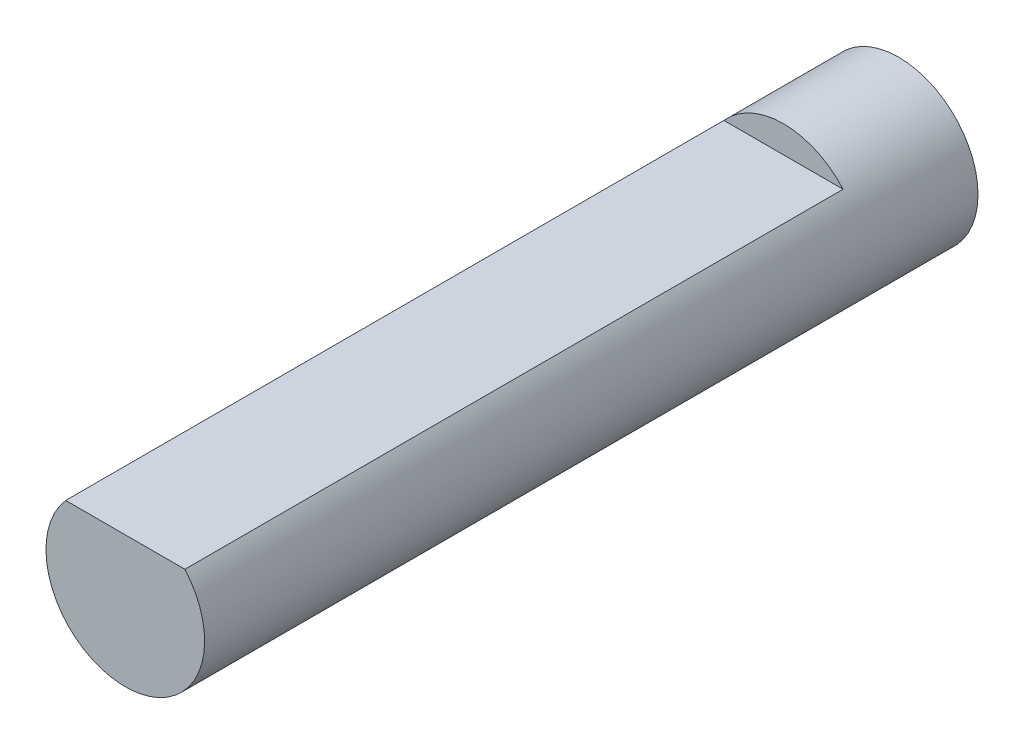
ISO-10303-21;
HEADER;
FILE_DESCRIPTION(('STEP AP214'),'2;1');
FILE_NAME('part.step','',(''),(''),'','','');
FILE_SCHEMA(('AUTOMOTIVE_DESIGN { 1 0 10303 214 1 1 1 1 }'));
ENDSEC;
DATA;
#1=APPLICATION_CONTEXT('core data for automotive mechanical design processes');
#2=APPLICATION_PROTOCOL_DEFINITION('international standard','automotive_design',2000,#1);
#3=PRODUCT_CONTEXT('',#1,'mechanical');
#4=PRODUCT('Part','Part','',(#3));
#5=PRODUCT_RELATED_PRODUCT_CATEGORY('part','',(#4));
#6=PRODUCT_DEFINITION_FORMATION('','',#4);
#7=PRODUCT_DEFINITION_CONTEXT('part definition',#1,'design');
#8=PRODUCT_DEFINITION('design','',#6,#7);
#9=PRODUCT_DEFINITION_SHAPE('','',#8);
#10=(LENGTH_UNIT() NAMED_UNIT(*) SI_UNIT(.MILLI.,.METRE.));
#11=(NAMED_UNIT(*) PLANE_ANGLE_UNIT() SI_UNIT($,.RADIAN.));
#12=(NAMED_UNIT(*) SI_UNIT($,.STERADIAN.) SOLID_ANGLE_UNIT());
#13=UNCERTAINTY_MEASURE_WITH_UNIT(LENGTH_MEASURE(1.E-05),#10,'distance_accuracy_value','');
#14=(GEOMETRIC_REPRESENTATION_CONTEXT(3) GLOBAL_UNCERTAINTY_ASSIGNED_CONTEXT((#13)) GLOBAL_UNIT_ASSIGNED_CONTEXT((#10,
#11,#12)) REPRESENTATION_CONTEXT('',''));
#15=CARTESIAN_POINT('',(0.,0.,0.));
#16=DIRECTION('',(0.,0.,1.));
#17=DIRECTION('',(1.,0.,0.));
#18=AXIS2_PLACEMENT_3D('',#15,#16,#17);
#19=CARTESIAN_POINT('',(0.,0.795,10.));
#20=DIRECTION('',(0.,1.,0.));
#21=DIRECTION('',(0.,0.,1.));
#22=AXIS2_PLACEMENT_3D('',#19,#20,#21);
#23=PLANE('',#22);
#24=DIRECTION('',(1.,0.,0.));
#25=VECTOR('',#24,1.);
#26=CARTESIAN_POINT('',(0.,0.795,0.));
#27=LINE('',#26,#25);
#28=CARTESIAN_POINT('',(-0.905538513813742,0.795,0.));
#29=VERTEX_POINT('',#28);
#30=CARTESIAN_POINT('',(0.905538513813742,0.795,0.));
#31=VERTEX_POINT('',#30);
#32=EDGE_CURVE('E73',#29,#31,#27,.T.);
#33=ORIENTED_EDGE('',*,*,#32,.F.);
#34=DIRECTION('',(0.,0.,-1.));
#35=VECTOR('',#34,1.);
#36=CARTESIAN_POINT('',(-0.905538513813742,0.795,10.));
#37=LINE('',#36,#35);
#38=CARTESIAN_POINT('',(-0.905538513813742,0.795,10.));
#39=VERTEX_POINT('',#38);
#40=EDGE_CURVE('E11',#39,#29,#37,.T.);
#41=ORIENTED_EDGE('',*,*,#40,.F.);
#42=DIRECTION('',(1.,0.,0.));
#43=VECTOR('',#42,1.);
#44=CARTESIAN_POINT('',(0.,0.795,10.));
#45=LINE('',#44,#43);
#46=CARTESIAN_POINT('',(0.905538513813742,0.795,10.));
#47=VERTEX_POINT('',#46);
#48=EDGE_CURVE('E76',#39,#47,#45,.T.);
#49=ORIENTED_EDGE('',*,*,#48,.T.);
#50=DIRECTION('',(0.,0.,-1.));
#51=VECTOR('',#50,1.);
#52=CARTESIAN_POINT('',(0.905538513813742,0.795,10.));
#53=LINE('',#52,#51);
#54=EDGE_CURVE('E50',#47,#31,#53,.T.);
#55=ORIENTED_EDGE('',*,*,#54,.T.);
#56=EDGE_LOOP('',(#33,#41,#49,#55));
#57=FACE_BOUND('',#56,.T.);
#58=ADVANCED_FACE('F41',(#57),#23,.T.);
#59=CARTESIAN_POINT('',(0.,0.,10.));
#60=DIRECTION('',(0.,0.,-1.));
#61=DIRECTION('',(-1.,0.,0.));
#62=AXIS2_PLACEMENT_3D('',#59,#60,#61);
#63=CYLINDRICAL_SURFACE('',#62,1.205);
#64=ORIENTED_EDGE('',*,*,#40,.T.);
#65=CARTESIAN_POINT('',(0.,0.,0.));
#66=DIRECTION('',(0.,0.,1.));
#67=DIRECTION('',(1.,0.,0.));
#68=AXIS2_PLACEMENT_3D('',#65,#66,#67);
#69=CIRCLE('',#68,1.205);
#70=EDGE_CURVE('E72',#31,#29,#69,.T.);
#71=ORIENTED_EDGE('',*,*,#70,.F.);
#72=ORIENTED_EDGE('',*,*,#54,.F.);
#73=CARTESIAN_POINT('',(0.,0.,10.));
#74=DIRECTION('',(0.,0.,1.));
#75=DIRECTION('',(1.,0.,0.));
#76=AXIS2_PLACEMENT_3D('',#73,#74,#75);
#77=CIRCLE('',#76,1.205);
#78=EDGE_CURVE('E56',#39,#47,#77,.T.);
#79=ORIENTED_EDGE('',*,*,#78,.F.);
#80=EDGE_LOOP('',(#64,#71,#72,#79));
#81=FACE_BOUND('',#80,.T.);
#82=CARTESIAN_POINT('',(0.,0.,-1.75));
#83=DIRECTION('',(0.,0.,1.));
#84=DIRECTION('',(1.,0.,0.));
#85=AXIS2_PLACEMENT_3D('',#82,#83,#84);
#86=CIRCLE('',#85,1.205);
#87=CARTESIAN_POINT('',(1.205,0.,-1.75));
#88=VERTEX_POINT('',#87);
#89=EDGE_CURVE('E77',#88,#88,#86,.T.);
#90=ORIENTED_EDGE('',*,*,#89,.T.);
#91=EDGE_LOOP('',(#90));
#92=FACE_BOUND('',#91,.T.);
#93=ADVANCED_FACE('F69',(#81,#92),#63,.T.);
#94=CARTESIAN_POINT('',(0.,0.,10.));
#95=DIRECTION('',(0.,0.,1.));
#96=DIRECTION('',(1.,0.,0.));
#97=AXIS2_PLACEMENT_3D('',#94,#95,#96);
#98=PLANE('',#97);
#99=ORIENTED_EDGE('',*,*,#48,.F.);
#100=ORIENTED_EDGE('',*,*,#78,.T.);
#101=EDGE_LOOP('',(#99,#100));
#102=FACE_BOUND('',#101,.T.);
#103=ADVANCED_FACE('F90',(#102),#98,.T.);
#104=CARTESIAN_POINT('',(0.,0.,-1.75));
#105=DIRECTION('',(0.,0.,1.));
#106=DIRECTION('',(1.,0.,0.));
#107=AXIS2_PLACEMENT_3D('',#104,#105,#106);
#108=PLANE('',#107);
#109=ORIENTED_EDGE('',*,*,#89,.F.);
#110=EDGE_LOOP('',(#109));
#111=FACE_BOUND('',#110,.T.);
#112=ADVANCED_FACE('F92',(#111),#108,.F.);
#113=CARTESIAN_POINT('',(0.,0.,0.));
#114=DIRECTION('',(0.,0.,1.));
#115=DIRECTION('',(1.,0.,0.));
#116=AXIS2_PLACEMENT_3D('',#113,#114,#115);
#117=PLANE('',#116);
#118=ORIENTED_EDGE('',*,*,#70,.T.);
#119=ORIENTED_EDGE('',*,*,#32,.T.);
#120=EDGE_LOOP('',(#118,#119));
#121=FACE_BOUND('',#120,.T.);
#122=ADVANCED_FACE('F79',(#121),#117,.T.);
#123=CLOSED_SHELL('',(#58,#93,#103,#112,#122));
#124=MANIFOLD_SOLID_BREP('B2',#123);
#125=ADVANCED_BREP_SHAPE_REPRESENTATION('',(#18,#124),#14);
#126=SHAPE_DEFINITION_REPRESENTATION(#9,#125);
ENDSEC;
END-ISO-10303-21;
